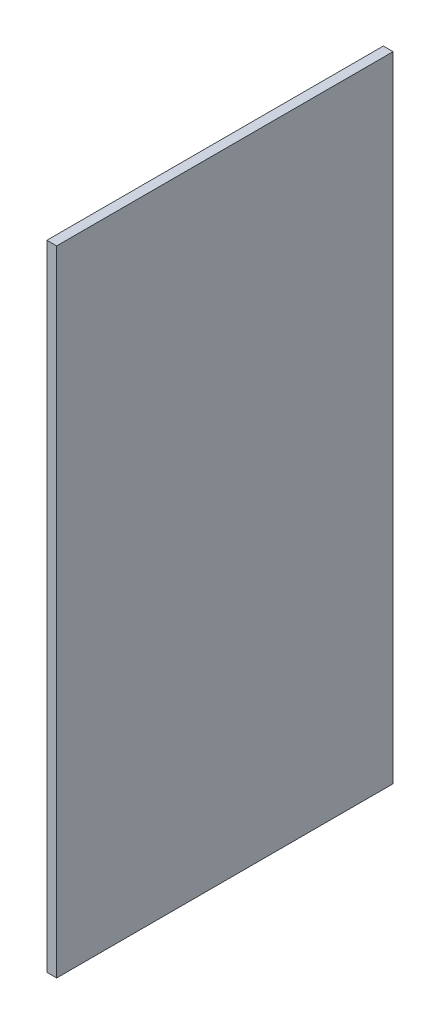
ISO-10303-21;
HEADER;
FILE_DESCRIPTION(('STEP AP214'),'2;1');
FILE_NAME('part.step','',(''),(''),'','','');
FILE_SCHEMA(('AUTOMOTIVE_DESIGN { 1 0 10303 214 1 1 1 1 }'));
ENDSEC;
DATA;
#1=APPLICATION_CONTEXT('core data for automotive mechanical design processes');
#2=APPLICATION_PROTOCOL_DEFINITION('international standard','automotive_design',2000,#1);
#3=PRODUCT_CONTEXT('',#1,'mechanical');
#4=PRODUCT('Part','Part','',(#3));
#5=PRODUCT_RELATED_PRODUCT_CATEGORY('part','',(#4));
#6=PRODUCT_DEFINITION_FORMATION('','',#4);
#7=PRODUCT_DEFINITION_CONTEXT('part definition',#1,'design');
#8=PRODUCT_DEFINITION('design','',#6,#7);
#9=PRODUCT_DEFINITION_SHAPE('','',#8);
#10=(LENGTH_UNIT() NAMED_UNIT(*) SI_UNIT(.MILLI.,.METRE.));
#11=(NAMED_UNIT(*) PLANE_ANGLE_UNIT() SI_UNIT($,.RADIAN.));
#12=(NAMED_UNIT(*) SI_UNIT($,.STERADIAN.) SOLID_ANGLE_UNIT());
#13=UNCERTAINTY_MEASURE_WITH_UNIT(LENGTH_MEASURE(1.E-05),#10,'distance_accuracy_value','');
#14=(GEOMETRIC_REPRESENTATION_CONTEXT(3) GLOBAL_UNCERTAINTY_ASSIGNED_CONTEXT((#13)) GLOBAL_UNIT_ASSIGNED_CONTEXT((#10,
#11,#12)) REPRESENTATION_CONTEXT('',''));
#15=CARTESIAN_POINT('',(0.,0.,0.));
#16=DIRECTION('',(0.,0.,1.));
#17=DIRECTION('',(1.,0.,0.));
#18=AXIS2_PLACEMENT_3D('',#15,#16,#17);
#19=CARTESIAN_POINT('',(691.,182.5,-757.5));
#20=DIRECTION('',(-1.,0.,0.));
#21=DIRECTION('',(0.,0.,1.));
#22=AXIS2_PLACEMENT_3D('',#19,#20,#21);
#23=PLANE('',#22);
#24=DIRECTION('',(0.,-1.,0.));
#25=VECTOR('',#24,1.);
#26=CARTESIAN_POINT('',(691.,182.5,0.));
#27=LINE('',#26,#25);
#28=CARTESIAN_POINT('',(691.,1610.,0.));
#29=VERTEX_POINT('',#28);
#30=CARTESIAN_POINT('',(691.,182.5,0.));
#31=VERTEX_POINT('',#30);
#32=EDGE_CURVE('E103',#29,#31,#27,.T.);
#33=ORIENTED_EDGE('',*,*,#32,.F.);
#34=DIRECTION('',(0.,0.,1.));
#35=VECTOR('',#34,1.);
#36=CARTESIAN_POINT('',(691.,1610.,-757.5));
#37=LINE('',#36,#35);
#38=CARTESIAN_POINT('',(691.,1610.,-757.5));
#39=VERTEX_POINT('',#38);
#40=EDGE_CURVE('E11',#39,#29,#37,.T.);
#41=ORIENTED_EDGE('',*,*,#40,.F.);
#42=DIRECTION('',(0.,-1.,0.));
#43=VECTOR('',#42,1.);
#44=CARTESIAN_POINT('',(691.,182.5,-757.5));
#45=LINE('',#44,#43);
#46=CARTESIAN_POINT('',(691.,182.5,-757.5));
#47=VERTEX_POINT('',#46);
#48=EDGE_CURVE('E97',#39,#47,#45,.T.);
#49=ORIENTED_EDGE('',*,*,#48,.T.);
#50=DIRECTION('',(0.,0.,1.));
#51=VECTOR('',#50,1.);
#52=CARTESIAN_POINT('',(691.,182.5,-757.5));
#53=LINE('',#52,#51);
#54=EDGE_CURVE('E42',#47,#31,#53,.T.);
#55=ORIENTED_EDGE('',*,*,#54,.T.);
#56=EDGE_LOOP('',(#33,#41,#49,#55));
#57=FACE_BOUND('',#56,.T.);
#58=ADVANCED_FACE('F39',(#57),#23,.T.);
#59=CARTESIAN_POINT('',(691.,1610.,-757.5));
#60=DIRECTION('',(0.,1.,0.));
#61=DIRECTION('',(0.,0.,1.));
#62=AXIS2_PLACEMENT_3D('',#59,#60,#61);
#63=PLANE('',#62);
#64=DIRECTION('',(-1.,0.,0.));
#65=VECTOR('',#64,1.);
#66=CARTESIAN_POINT('',(691.,1610.,0.));
#67=LINE('',#66,#65);
#68=CARTESIAN_POINT('',(713.,1610.,0.));
#69=VERTEX_POINT('',#68);
#70=EDGE_CURVE('E99',#69,#29,#67,.T.);
#71=ORIENTED_EDGE('',*,*,#70,.F.);
#72=DIRECTION('',(0.,0.,1.));
#73=VECTOR('',#72,1.);
#74=CARTESIAN_POINT('',(713.,1610.,-757.5));
#75=LINE('',#74,#73);
#76=CARTESIAN_POINT('',(713.,1610.,-757.5));
#77=VERTEX_POINT('',#76);
#78=EDGE_CURVE('E48',#77,#69,#75,.T.);
#79=ORIENTED_EDGE('',*,*,#78,.F.);
#80=DIRECTION('',(-1.,0.,0.));
#81=VECTOR('',#80,1.);
#82=CARTESIAN_POINT('',(691.,1610.,-757.5));
#83=LINE('',#82,#81);
#84=EDGE_CURVE('E94',#77,#39,#83,.T.);
#85=ORIENTED_EDGE('',*,*,#84,.T.);
#86=ORIENTED_EDGE('',*,*,#40,.T.);
#87=EDGE_LOOP('',(#71,#79,#85,#86));
#88=FACE_BOUND('',#87,.T.);
#89=ADVANCED_FACE('F113',(#88),#63,.T.);
#90=CARTESIAN_POINT('',(713.,182.5,-757.5));
#91=DIRECTION('',(1.,0.,0.));
#92=DIRECTION('',(0.,0.,-1.));
#93=AXIS2_PLACEMENT_3D('',#90,#91,#92);
#94=PLANE('',#93);
#95=DIRECTION('',(0.,1.,0.));
#96=VECTOR('',#95,1.);
#97=CARTESIAN_POINT('',(713.,182.5,0.));
#98=LINE('',#97,#96);
#99=CARTESIAN_POINT('',(713.,182.5,0.));
#100=VERTEX_POINT('',#99);
#101=EDGE_CURVE('E89',#100,#69,#98,.T.);
#102=ORIENTED_EDGE('',*,*,#101,.F.);
#103=DIRECTION('',(0.,0.,1.));
#104=VECTOR('',#103,1.);
#105=CARTESIAN_POINT('',(713.,182.5,-757.5));
#106=LINE('',#105,#104);
#107=CARTESIAN_POINT('',(713.,182.5,-757.5));
#108=VERTEX_POINT('',#107);
#109=EDGE_CURVE('E84',#108,#100,#106,.T.);
#110=ORIENTED_EDGE('',*,*,#109,.F.);
#111=DIRECTION('',(0.,1.,0.));
#112=VECTOR('',#111,1.);
#113=CARTESIAN_POINT('',(713.,182.5,-757.5));
#114=LINE('',#113,#112);
#115=EDGE_CURVE('E87',#108,#77,#114,.T.);
#116=ORIENTED_EDGE('',*,*,#115,.T.);
#117=ORIENTED_EDGE('',*,*,#78,.T.);
#118=EDGE_LOOP('',(#102,#110,#116,#117));
#119=FACE_BOUND('',#118,.T.);
#120=ADVANCED_FACE('F86',(#119),#94,.T.);
#121=CARTESIAN_POINT('',(691.,182.5,-757.5));
#122=DIRECTION('',(0.,-1.,0.));
#123=DIRECTION('',(0.,0.,-1.));
#124=AXIS2_PLACEMENT_3D('',#121,#122,#123);
#125=PLANE('',#124);
#126=DIRECTION('',(1.,0.,0.));
#127=VECTOR('',#126,1.);
#128=CARTESIAN_POINT('',(691.,182.5,0.));
#129=LINE('',#128,#127);
#130=EDGE_CURVE('E106',#31,#100,#129,.T.);
#131=ORIENTED_EDGE('',*,*,#130,.F.);
#132=ORIENTED_EDGE('',*,*,#54,.F.);
#133=DIRECTION('',(1.,0.,0.));
#134=VECTOR('',#133,1.);
#135=CARTESIAN_POINT('',(691.,182.5,-757.5));
#136=LINE('',#135,#134);
#137=EDGE_CURVE('E93',#47,#108,#136,.T.);
#138=ORIENTED_EDGE('',*,*,#137,.T.);
#139=ORIENTED_EDGE('',*,*,#109,.T.);
#140=EDGE_LOOP('',(#131,#132,#138,#139));
#141=FACE_BOUND('',#140,.T.);
#142=ADVANCED_FACE('F96',(#141),#125,.T.);
#143=CARTESIAN_POINT('',(0.,0.,-757.5));
#144=DIRECTION('',(0.,0.,-1.));
#145=DIRECTION('',(-1.,0.,0.));
#146=AXIS2_PLACEMENT_3D('',#143,#144,#145);
#147=PLANE('',#146);
#148=ORIENTED_EDGE('',*,*,#48,.F.);
#149=ORIENTED_EDGE('',*,*,#84,.F.);
#150=ORIENTED_EDGE('',*,*,#115,.F.);
#151=ORIENTED_EDGE('',*,*,#137,.F.);
#152=EDGE_LOOP('',(#148,#149,#150,#151));
#153=FACE_BOUND('',#152,.T.);
#154=ADVANCED_FACE('F92',(#153),#147,.T.);
#155=CARTESIAN_POINT('',(0.,0.,0.));
#156=DIRECTION('',(0.,0.,-1.));
#157=DIRECTION('',(-1.,0.,0.));
#158=AXIS2_PLACEMENT_3D('',#155,#156,#157);
#159=PLANE('',#158);
#160=ORIENTED_EDGE('',*,*,#32,.T.);
#161=ORIENTED_EDGE('',*,*,#130,.T.);
#162=ORIENTED_EDGE('',*,*,#101,.T.);
#163=ORIENTED_EDGE('',*,*,#70,.T.);
#164=EDGE_LOOP('',(#160,#161,#162,#163));
#165=FACE_BOUND('',#164,.T.);
#166=ADVANCED_FACE('F112',(#165),#159,.F.);
#167=CLOSED_SHELL('',(#58,#89,#120,#142,#154,#166));
#168=MANIFOLD_SOLID_BREP('B2',#167);
#169=ADVANCED_BREP_SHAPE_REPRESENTATION('',(#18,#168),#14);
#170=SHAPE_DEFINITION_REPRESENTATION(#9,#169);
ENDSEC;
END-ISO-10303-21;
